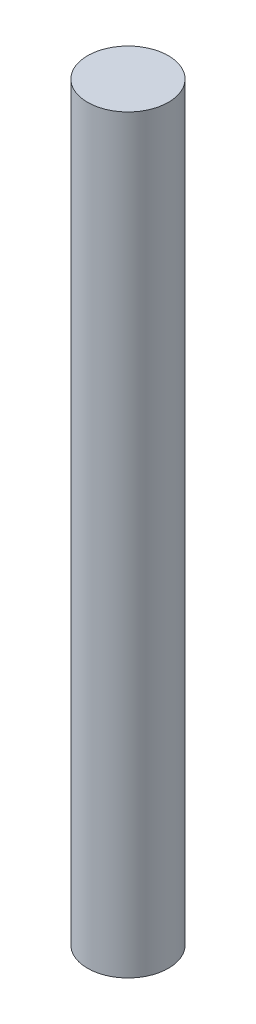
ISO-10303-21;
HEADER;
FILE_DESCRIPTION(('STEP AP214'),'2;1');
FILE_NAME('part.step','',(''),(''),'','','');
FILE_SCHEMA(('AUTOMOTIVE_DESIGN { 1 0 10303 214 1 1 1 1 }'));
ENDSEC;
DATA;
#1=APPLICATION_CONTEXT('core data for automotive mechanical design processes');
#2=APPLICATION_PROTOCOL_DEFINITION('international standard','automotive_design',2000,#1);
#3=PRODUCT_CONTEXT('',#1,'mechanical');
#4=PRODUCT('Part','Part','',(#3));
#5=PRODUCT_RELATED_PRODUCT_CATEGORY('part','',(#4));
#6=PRODUCT_DEFINITION_FORMATION('','',#4);
#7=PRODUCT_DEFINITION_CONTEXT('part definition',#1,'design');
#8=PRODUCT_DEFINITION('design','',#6,#7);
#9=PRODUCT_DEFINITION_SHAPE('','',#8);
#10=(LENGTH_UNIT() NAMED_UNIT(*) SI_UNIT(.MILLI.,.METRE.));
#11=(NAMED_UNIT(*) PLANE_ANGLE_UNIT() SI_UNIT($,.RADIAN.));
#12=(NAMED_UNIT(*) SI_UNIT($,.STERADIAN.) SOLID_ANGLE_UNIT());
#13=UNCERTAINTY_MEASURE_WITH_UNIT(LENGTH_MEASURE(1.E-05),#10,'distance_accuracy_value','');
#14=(GEOMETRIC_REPRESENTATION_CONTEXT(3) GLOBAL_UNCERTAINTY_ASSIGNED_CONTEXT((#13)) GLOBAL_UNIT_ASSIGNED_CONTEXT((#10,
#11,#12)) REPRESENTATION_CONTEXT('',''));
#15=CARTESIAN_POINT('',(0.,0.,0.));
#16=DIRECTION('',(0.,0.,1.));
#17=DIRECTION('',(1.,0.,0.));
#18=AXIS2_PLACEMENT_3D('',#15,#16,#17);
#19=CARTESIAN_POINT('',(0.,23.2,0.));
#20=DIRECTION('',(0.,-1.,0.));
#21=DIRECTION('',(0.,0.,-1.));
#22=AXIS2_PLACEMENT_3D('',#19,#20,#21);
#23=CYLINDRICAL_SURFACE('',#22,1.25);
#24=CARTESIAN_POINT('',(0.,23.2,0.));
#25=DIRECTION('',(0.,1.,0.));
#26=DIRECTION('',(0.,0.,1.));
#27=AXIS2_PLACEMENT_3D('',#24,#25,#26);
#28=CIRCLE('',#27,1.25);
#29=CARTESIAN_POINT('',(0.,23.2,1.25));
#30=VERTEX_POINT('',#29);
#31=EDGE_CURVE('E10',#30,#30,#28,.T.);
#32=ORIENTED_EDGE('',*,*,#31,.F.);
#33=EDGE_LOOP('',(#32));
#34=FACE_BOUND('',#33,.T.);
#35=CARTESIAN_POINT('',(0.,0.,0.));
#36=DIRECTION('',(0.,1.,0.));
#37=DIRECTION('',(0.,0.,1.));
#38=AXIS2_PLACEMENT_3D('',#35,#36,#37);
#39=CIRCLE('',#38,1.25);
#40=CARTESIAN_POINT('',(0.,0.,1.25));
#41=VERTEX_POINT('',#40);
#42=EDGE_CURVE('E34',#41,#41,#39,.T.);
#43=ORIENTED_EDGE('',*,*,#42,.T.);
#44=EDGE_LOOP('',(#43));
#45=FACE_BOUND('',#44,.T.);
#46=ADVANCED_FACE('F31',(#34,#45),#23,.T.);
#47=CARTESIAN_POINT('',(0.,23.2,0.));
#48=DIRECTION('',(0.,1.,0.));
#49=DIRECTION('',(0.,0.,1.));
#50=AXIS2_PLACEMENT_3D('',#47,#48,#49);
#51=PLANE('',#50);
#52=ORIENTED_EDGE('',*,*,#31,.T.);
#53=EDGE_LOOP('',(#52));
#54=FACE_BOUND('',#53,.T.);
#55=ADVANCED_FACE('F46',(#54),#51,.T.);
#56=CARTESIAN_POINT('',(0.,0.,0.));
#57=DIRECTION('',(0.,1.,0.));
#58=DIRECTION('',(0.,0.,1.));
#59=AXIS2_PLACEMENT_3D('',#56,#57,#58);
#60=PLANE('',#59);
#61=ORIENTED_EDGE('',*,*,#42,.F.);
#62=EDGE_LOOP('',(#61));
#63=FACE_BOUND('',#62,.T.);
#64=ADVANCED_FACE('F44',(#63),#60,.F.);
#65=CLOSED_SHELL('',(#46,#55,#64));
#66=MANIFOLD_SOLID_BREP('B2',#65);
#67=ADVANCED_BREP_SHAPE_REPRESENTATION('',(#18,#66),#14);
#68=SHAPE_DEFINITION_REPRESENTATION(#9,#67);
ENDSEC;
END-ISO-10303-21;
